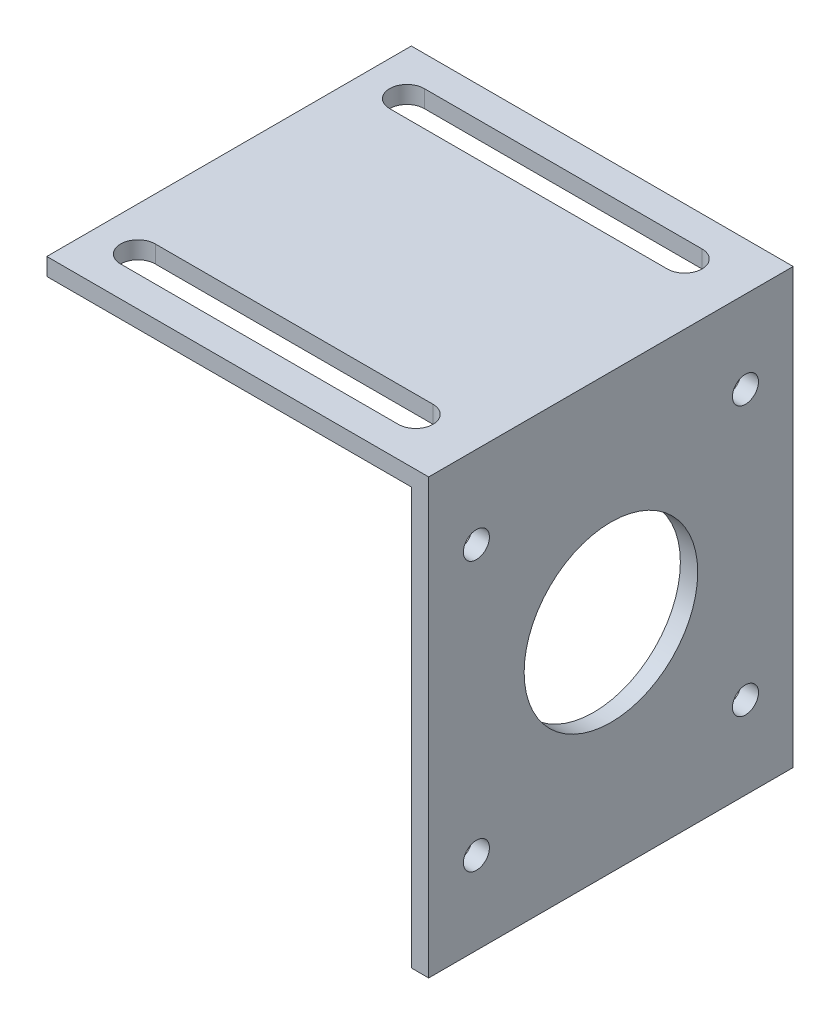
ISO-10303-21;
HEADER;
FILE_DESCRIPTION(('STEP AP214'),'2;1');
FILE_NAME('part.step','',(''),(''),'','','');
FILE_SCHEMA(('AUTOMOTIVE_DESIGN { 1 0 10303 214 1 1 1 1 }'));
ENDSEC;
DATA;
#1=APPLICATION_CONTEXT('core data for automotive mechanical design processes');
#2=APPLICATION_PROTOCOL_DEFINITION('international standard','automotive_design',2000,#1);
#3=PRODUCT_CONTEXT('',#1,'mechanical');
#4=PRODUCT('Part','Part','',(#3));
#5=PRODUCT_RELATED_PRODUCT_CATEGORY('part','',(#4));
#6=PRODUCT_DEFINITION_FORMATION('','',#4);
#7=PRODUCT_DEFINITION_CONTEXT('part definition',#1,'design');
#8=PRODUCT_DEFINITION('design','',#6,#7);
#9=PRODUCT_DEFINITION_SHAPE('','',#8);
#10=(LENGTH_UNIT() NAMED_UNIT(*) SI_UNIT(.MILLI.,.METRE.));
#11=(NAMED_UNIT(*) PLANE_ANGLE_UNIT() SI_UNIT($,.RADIAN.));
#12=(NAMED_UNIT(*) SI_UNIT($,.STERADIAN.) SOLID_ANGLE_UNIT());
#13=UNCERTAINTY_MEASURE_WITH_UNIT(LENGTH_MEASURE(1.E-05),#10,'distance_accuracy_value','');
#14=(GEOMETRIC_REPRESENTATION_CONTEXT(3) GLOBAL_UNCERTAINTY_ASSIGNED_CONTEXT((#13)) GLOBAL_UNIT_ASSIGNED_CONTEXT((#10,
#11,#12)) REPRESENTATION_CONTEXT('',''));
#15=CARTESIAN_POINT('',(0.,0.,0.));
#16=DIRECTION('',(0.,0.,1.));
#17=DIRECTION('',(1.,0.,0.));
#18=AXIS2_PLACEMENT_3D('',#15,#16,#17);
#19=CARTESIAN_POINT('',(2.,-25.,-21.));
#20=DIRECTION('',(0.,0.,1.));
#21=DIRECTION('',(1.,0.,0.));
#22=AXIS2_PLACEMENT_3D('',#19,#20,#21);
#23=PLANE('',#22);
#24=DIRECTION('',(-1.,0.,0.));
#25=VECTOR('',#24,1.);
#26=CARTESIAN_POINT('',(-42.,23.,-21.));
#27=LINE('',#26,#25);
#28=CARTESIAN_POINT('',(0.,23.,-21.));
#29=VERTEX_POINT('',#28);
#30=CARTESIAN_POINT('',(-42.,23.,-21.));
#31=VERTEX_POINT('',#30);
#32=EDGE_CURVE('E301',#29,#31,#27,.T.);
#33=ORIENTED_EDGE('',*,*,#32,.T.);
#34=DIRECTION('',(0.,-1.,0.));
#35=VECTOR('',#34,1.);
#36=CARTESIAN_POINT('',(-42.,25.,-21.));
#37=LINE('',#36,#35);
#38=CARTESIAN_POINT('',(-42.,25.,-21.));
#39=VERTEX_POINT('',#38);
#40=EDGE_CURVE('E205',#39,#31,#37,.T.);
#41=ORIENTED_EDGE('',*,*,#40,.F.);
#42=DIRECTION('',(-1.,0.,0.));
#43=VECTOR('',#42,1.);
#44=CARTESIAN_POINT('',(2.,25.,-21.));
#45=LINE('',#44,#43);
#46=CARTESIAN_POINT('',(2.,25.,-21.));
#47=VERTEX_POINT('',#46);
#48=EDGE_CURVE('E11',#47,#39,#45,.T.);
#49=ORIENTED_EDGE('',*,*,#48,.F.);
#50=DIRECTION('',(0.,1.,0.));
#51=VECTOR('',#50,1.);
#52=CARTESIAN_POINT('',(2.,-25.,-21.));
#53=LINE('',#52,#51);
#54=CARTESIAN_POINT('',(2.,-25.,-21.));
#55=VERTEX_POINT('',#54);
#56=EDGE_CURVE('E251',#55,#47,#53,.T.);
#57=ORIENTED_EDGE('',*,*,#56,.F.);
#58=DIRECTION('',(-1.,0.,0.));
#59=VECTOR('',#58,1.);
#60=CARTESIAN_POINT('',(2.,-25.,-21.));
#61=LINE('',#60,#59);
#62=CARTESIAN_POINT('',(0.,-25.,-21.));
#63=VERTEX_POINT('',#62);
#64=EDGE_CURVE('E265',#55,#63,#61,.T.);
#65=ORIENTED_EDGE('',*,*,#64,.T.);
#66=DIRECTION('',(0.,1.,0.));
#67=VECTOR('',#66,1.);
#68=CARTESIAN_POINT('',(0.,-25.,-21.));
#69=LINE('',#68,#67);
#70=EDGE_CURVE('E247',#63,#29,#69,.T.);
#71=ORIENTED_EDGE('',*,*,#70,.T.);
#72=EDGE_LOOP('',(#33,#41,#49,#57,#65,#71));
#73=FACE_BOUND('',#72,.T.);
#74=ADVANCED_FACE('F39',(#73),#23,.F.);
#75=CARTESIAN_POINT('',(2.,-25.,21.));
#76=DIRECTION('',(0.,0.,-1.));
#77=DIRECTION('',(-1.,0.,0.));
#78=AXIS2_PLACEMENT_3D('',#75,#76,#77);
#79=PLANE('',#78);
#80=DIRECTION('',(1.,0.,0.));
#81=VECTOR('',#80,1.);
#82=CARTESIAN_POINT('',(-42.,23.,21.));
#83=LINE('',#82,#81);
#84=CARTESIAN_POINT('',(-42.,23.,21.));
#85=VERTEX_POINT('',#84);
#86=CARTESIAN_POINT('',(0.,23.,21.));
#87=VERTEX_POINT('',#86);
#88=EDGE_CURVE('E227',#85,#87,#83,.T.);
#89=ORIENTED_EDGE('',*,*,#88,.T.);
#90=DIRECTION('',(0.,-1.,0.));
#91=VECTOR('',#90,1.);
#92=CARTESIAN_POINT('',(0.,-25.,21.));
#93=LINE('',#92,#91);
#94=CARTESIAN_POINT('',(0.,-25.,21.));
#95=VERTEX_POINT('',#94);
#96=EDGE_CURVE('E268',#87,#95,#93,.T.);
#97=ORIENTED_EDGE('',*,*,#96,.T.);
#98=DIRECTION('',(-1.,0.,0.));
#99=VECTOR('',#98,1.);
#100=CARTESIAN_POINT('',(2.,-25.,21.));
#101=LINE('',#100,#99);
#102=CARTESIAN_POINT('',(2.,-25.,21.));
#103=VERTEX_POINT('',#102);
#104=EDGE_CURVE('E276',#103,#95,#101,.T.);
#105=ORIENTED_EDGE('',*,*,#104,.F.);
#106=DIRECTION('',(0.,-1.,0.));
#107=VECTOR('',#106,1.);
#108=CARTESIAN_POINT('',(2.,-25.,21.));
#109=LINE('',#108,#107);
#110=CARTESIAN_POINT('',(2.,25.,21.));
#111=VERTEX_POINT('',#110);
#112=EDGE_CURVE('E259',#111,#103,#109,.T.);
#113=ORIENTED_EDGE('',*,*,#112,.F.);
#114=DIRECTION('',(-1.,0.,0.));
#115=VECTOR('',#114,1.);
#116=CARTESIAN_POINT('',(2.,25.,21.));
#117=LINE('',#116,#115);
#118=CARTESIAN_POINT('',(-42.,25.,21.));
#119=VERTEX_POINT('',#118);
#120=EDGE_CURVE('E47',#111,#119,#117,.T.);
#121=ORIENTED_EDGE('',*,*,#120,.T.);
#122=DIRECTION('',(0.,-1.,0.));
#123=VECTOR('',#122,1.);
#124=CARTESIAN_POINT('',(-42.,25.,21.));
#125=LINE('',#124,#123);
#126=EDGE_CURVE('E201',#119,#85,#125,.T.);
#127=ORIENTED_EDGE('',*,*,#126,.T.);
#128=EDGE_LOOP('',(#89,#97,#105,#113,#121,#127));
#129=FACE_BOUND('',#128,.T.);
#130=ADVANCED_FACE('F284',(#129),#79,.F.);
#131=CARTESIAN_POINT('',(-37.,25.,13.5));
#132=DIRECTION('',(0.,0.,1.));
#133=DIRECTION('',(1.,0.,0.));
#134=AXIS2_PLACEMENT_3D('',#131,#132,#133);
#135=PLANE('',#134);
#136=DIRECTION('',(0.,-1.,0.));
#137=VECTOR('',#136,1.);
#138=CARTESIAN_POINT('',(-37.,25.,13.5));
#139=LINE('',#138,#137);
#140=CARTESIAN_POINT('',(-37.,25.,13.5));
#141=VERTEX_POINT('',#140);
#142=CARTESIAN_POINT('',(-37.,23.,13.5));
#143=VERTEX_POINT('',#142);
#144=EDGE_CURVE('E322',#141,#143,#139,.T.);
#145=ORIENTED_EDGE('',*,*,#144,.T.);
#146=DIRECTION('',(-1.,0.,0.));
#147=VECTOR('',#146,1.);
#148=CARTESIAN_POINT('',(-37.,23.,13.5));
#149=LINE('',#148,#147);
#150=CARTESIAN_POINT('',(-5.,23.,13.5));
#151=VERTEX_POINT('',#150);
#152=EDGE_CURVE('E54',#151,#143,#149,.T.);
#153=ORIENTED_EDGE('',*,*,#152,.F.);
#154=DIRECTION('',(0.,-1.,0.));
#155=VECTOR('',#154,1.);
#156=CARTESIAN_POINT('',(-5.,25.,13.5));
#157=LINE('',#156,#155);
#158=CARTESIAN_POINT('',(-5.,25.,13.5));
#159=VERTEX_POINT('',#158);
#160=EDGE_CURVE('E168',#159,#151,#157,.T.);
#161=ORIENTED_EDGE('',*,*,#160,.F.);
#162=DIRECTION('',(-1.,0.,0.));
#163=VECTOR('',#162,1.);
#164=CARTESIAN_POINT('',(-37.,25.,13.5));
#165=LINE('',#164,#163);
#166=EDGE_CURVE('E319',#159,#141,#165,.T.);
#167=ORIENTED_EDGE('',*,*,#166,.T.);
#168=EDGE_LOOP('',(#145,#153,#161,#167));
#169=FACE_BOUND('',#168,.T.);
#170=ADVANCED_FACE('F331',(#169),#135,.T.);
#171=CARTESIAN_POINT('',(-5.00000000000001,25.,15.5));
#172=DIRECTION('',(0.,-1.,0.));
#173=DIRECTION('',(0.,0.,-1.));
#174=AXIS2_PLACEMENT_3D('',#171,#172,#173);
#175=CYLINDRICAL_SURFACE('',#174,2.00000000000001);
#176=ORIENTED_EDGE('',*,*,#160,.T.);
#177=CARTESIAN_POINT('',(-5.00000000000001,23.,15.5));
#178=DIRECTION('',(0.,1.,0.));
#179=DIRECTION('',(0.,0.,-1.));
#180=AXIS2_PLACEMENT_3D('',#177,#178,#179);
#181=CIRCLE('',#180,2.00000000000001);
#182=CARTESIAN_POINT('',(-5.00000000000001,23.,17.5));
#183=VERTEX_POINT('',#182);
#184=EDGE_CURVE('E156',#183,#151,#181,.T.);
#185=ORIENTED_EDGE('',*,*,#184,.F.);
#186=DIRECTION('',(0.,-1.,0.));
#187=VECTOR('',#186,1.);
#188=CARTESIAN_POINT('',(-5.00000000000001,25.,17.5));
#189=LINE('',#188,#187);
#190=CARTESIAN_POINT('',(-5.00000000000001,25.,17.5));
#191=VERTEX_POINT('',#190);
#192=EDGE_CURVE('E154',#191,#183,#189,.T.);
#193=ORIENTED_EDGE('',*,*,#192,.F.);
#194=CARTESIAN_POINT('',(-5.00000000000001,25.,15.5));
#195=DIRECTION('',(0.,1.,0.));
#196=DIRECTION('',(0.,0.,-1.));
#197=AXIS2_PLACEMENT_3D('',#194,#195,#196);
#198=CIRCLE('',#197,2.00000000000001);
#199=EDGE_CURVE('E315',#191,#159,#198,.T.);
#200=ORIENTED_EDGE('',*,*,#199,.T.);
#201=EDGE_LOOP('',(#176,#185,#193,#200));
#202=FACE_BOUND('',#201,.T.);
#203=ADVANCED_FACE('F327',(#202),#175,.F.);
#204=CARTESIAN_POINT('',(-37.,25.,17.5));
#205=DIRECTION('',(0.,0.,-1.));
#206=DIRECTION('',(-1.,0.,0.));
#207=AXIS2_PLACEMENT_3D('',#204,#205,#206);
#208=PLANE('',#207);
#209=ORIENTED_EDGE('',*,*,#192,.T.);
#210=DIRECTION('',(1.,0.,0.));
#211=VECTOR('',#210,1.);
#212=CARTESIAN_POINT('',(-37.,23.,17.5));
#213=LINE('',#212,#211);
#214=CARTESIAN_POINT('',(-37.,23.,17.5));
#215=VERTEX_POINT('',#214);
#216=EDGE_CURVE('E139',#215,#183,#213,.T.);
#217=ORIENTED_EDGE('',*,*,#216,.F.);
#218=DIRECTION('',(0.,-1.,0.));
#219=VECTOR('',#218,1.);
#220=CARTESIAN_POINT('',(-37.,25.,17.5));
#221=LINE('',#220,#219);
#222=CARTESIAN_POINT('',(-37.,25.,17.5));
#223=VERTEX_POINT('',#222);
#224=EDGE_CURVE('E151',#223,#215,#221,.T.);
#225=ORIENTED_EDGE('',*,*,#224,.F.);
#226=DIRECTION('',(1.,0.,0.));
#227=VECTOR('',#226,1.);
#228=CARTESIAN_POINT('',(-37.,25.,17.5));
#229=LINE('',#228,#227);
#230=EDGE_CURVE('E312',#223,#191,#229,.T.);
#231=ORIENTED_EDGE('',*,*,#230,.T.);
#232=EDGE_LOOP('',(#209,#217,#225,#231));
#233=FACE_BOUND('',#232,.T.);
#234=ADVANCED_FACE('F150',(#233),#208,.T.);
#235=CARTESIAN_POINT('',(-37.,25.,15.5));
#236=DIRECTION('',(0.,-1.,0.));
#237=DIRECTION('',(0.,0.,-1.));
#238=AXIS2_PLACEMENT_3D('',#235,#236,#237);
#239=CYLINDRICAL_SURFACE('',#238,2.);
#240=ORIENTED_EDGE('',*,*,#224,.T.);
#241=CARTESIAN_POINT('',(-37.,23.,15.5));
#242=DIRECTION('',(0.,1.,0.));
#243=DIRECTION('',(0.,0.,-1.));
#244=AXIS2_PLACEMENT_3D('',#241,#242,#243);
#245=CIRCLE('',#244,2.);
#246=EDGE_CURVE('E136',#143,#215,#245,.T.);
#247=ORIENTED_EDGE('',*,*,#246,.F.);
#248=ORIENTED_EDGE('',*,*,#144,.F.);
#249=CARTESIAN_POINT('',(-37.,25.,15.5));
#250=DIRECTION('',(0.,1.,0.));
#251=DIRECTION('',(0.,0.,-1.));
#252=AXIS2_PLACEMENT_3D('',#249,#250,#251);
#253=CIRCLE('',#252,2.);
#254=EDGE_CURVE('E160',#141,#223,#253,.T.);
#255=ORIENTED_EDGE('',*,*,#254,.T.);
#256=EDGE_LOOP('',(#240,#247,#248,#255));
#257=FACE_BOUND('',#256,.T.);
#258=ADVANCED_FACE('F158',(#257),#239,.F.);
#259=CARTESIAN_POINT('',(-37.,25.,-17.5));
#260=DIRECTION('',(0.,0.,1.));
#261=DIRECTION('',(1.,0.,0.));
#262=AXIS2_PLACEMENT_3D('',#259,#260,#261);
#263=PLANE('',#262);
#264=DIRECTION('',(0.,-1.,0.));
#265=VECTOR('',#264,1.);
#266=CARTESIAN_POINT('',(-37.,25.,-17.5));
#267=LINE('',#266,#265);
#268=CARTESIAN_POINT('',(-37.,25.,-17.5));
#269=VERTEX_POINT('',#268);
#270=CARTESIAN_POINT('',(-37.,23.,-17.5));
#271=VERTEX_POINT('',#270);
#272=EDGE_CURVE('E181',#269,#271,#267,.T.);
#273=ORIENTED_EDGE('',*,*,#272,.T.);
#274=DIRECTION('',(-1.,0.,0.));
#275=VECTOR('',#274,1.);
#276=CARTESIAN_POINT('',(-37.,23.,-17.5));
#277=LINE('',#276,#275);
#278=CARTESIAN_POINT('',(-5.00000000000001,23.,-17.5));
#279=VERTEX_POINT('',#278);
#280=EDGE_CURVE('E62',#279,#271,#277,.T.);
#281=ORIENTED_EDGE('',*,*,#280,.F.);
#282=DIRECTION('',(0.,-1.,0.));
#283=VECTOR('',#282,1.);
#284=CARTESIAN_POINT('',(-5.00000000000001,25.,-17.5));
#285=LINE('',#284,#283);
#286=CARTESIAN_POINT('',(-5.00000000000001,25.,-17.5));
#287=VERTEX_POINT('',#286);
#288=EDGE_CURVE('E185',#287,#279,#285,.T.);
#289=ORIENTED_EDGE('',*,*,#288,.F.);
#290=DIRECTION('',(-1.,0.,0.));
#291=VECTOR('',#290,1.);
#292=CARTESIAN_POINT('',(-37.,25.,-17.5));
#293=LINE('',#292,#291);
#294=EDGE_CURVE('E178',#287,#269,#293,.T.);
#295=ORIENTED_EDGE('',*,*,#294,.T.);
#296=EDGE_LOOP('',(#273,#281,#289,#295));
#297=FACE_BOUND('',#296,.T.);
#298=ADVANCED_FACE('F419',(#297),#263,.T.);
#299=CARTESIAN_POINT('',(-5.00000000000001,25.,-15.5));
#300=DIRECTION('',(0.,-1.,0.));
#301=DIRECTION('',(0.,0.,-1.));
#302=AXIS2_PLACEMENT_3D('',#299,#300,#301);
#303=CYLINDRICAL_SURFACE('',#302,2.00000000000001);
#304=ORIENTED_EDGE('',*,*,#288,.T.);
#305=CARTESIAN_POINT('',(-5.00000000000001,23.,-15.5));
#306=DIRECTION('',(0.,1.,0.));
#307=DIRECTION('',(0.,0.,1.));
#308=AXIS2_PLACEMENT_3D('',#305,#306,#307);
#309=CIRCLE('',#308,2.00000000000001);
#310=CARTESIAN_POINT('',(-5.,23.,-13.5));
#311=VERTEX_POINT('',#310);
#312=EDGE_CURVE('E343',#311,#279,#309,.T.);
#313=ORIENTED_EDGE('',*,*,#312,.F.);
#314=DIRECTION('',(0.,-1.,0.));
#315=VECTOR('',#314,1.);
#316=CARTESIAN_POINT('',(-5.,25.,-13.5));
#317=LINE('',#316,#315);
#318=CARTESIAN_POINT('',(-5.,25.,-13.5));
#319=VERTEX_POINT('',#318);
#320=EDGE_CURVE('E189',#319,#311,#317,.T.);
#321=ORIENTED_EDGE('',*,*,#320,.F.);
#322=CARTESIAN_POINT('',(-5.00000000000001,25.,-15.5));
#323=DIRECTION('',(0.,1.,0.));
#324=DIRECTION('',(0.,0.,1.));
#325=AXIS2_PLACEMENT_3D('',#322,#323,#324);
#326=CIRCLE('',#325,2.00000000000001);
#327=EDGE_CURVE('E174',#319,#287,#326,.T.);
#328=ORIENTED_EDGE('',*,*,#327,.T.);
#329=EDGE_LOOP('',(#304,#313,#321,#328));
#330=FACE_BOUND('',#329,.T.);
#331=ADVANCED_FACE('F415',(#330),#303,.F.);
#332=CARTESIAN_POINT('',(-37.,25.,-13.5));
#333=DIRECTION('',(0.,0.,-1.));
#334=DIRECTION('',(-1.,0.,0.));
#335=AXIS2_PLACEMENT_3D('',#332,#333,#334);
#336=PLANE('',#335);
#337=ORIENTED_EDGE('',*,*,#320,.T.);
#338=DIRECTION('',(1.,0.,0.));
#339=VECTOR('',#338,1.);
#340=CARTESIAN_POINT('',(-37.,23.,-13.5));
#341=LINE('',#340,#339);
#342=CARTESIAN_POINT('',(-37.,23.,-13.5));
#343=VERTEX_POINT('',#342);
#344=EDGE_CURVE('E337',#343,#311,#341,.T.);
#345=ORIENTED_EDGE('',*,*,#344,.F.);
#346=DIRECTION('',(0.,-1.,0.));
#347=VECTOR('',#346,1.);
#348=CARTESIAN_POINT('',(-37.,25.,-13.5));
#349=LINE('',#348,#347);
#350=CARTESIAN_POINT('',(-37.,25.,-13.5));
#351=VERTEX_POINT('',#350);
#352=EDGE_CURVE('E193',#351,#343,#349,.T.);
#353=ORIENTED_EDGE('',*,*,#352,.F.);
#354=DIRECTION('',(1.,0.,0.));
#355=VECTOR('',#354,1.);
#356=CARTESIAN_POINT('',(-37.,25.,-13.5));
#357=LINE('',#356,#355);
#358=EDGE_CURVE('E166',#351,#319,#357,.T.);
#359=ORIENTED_EDGE('',*,*,#358,.T.);
#360=EDGE_LOOP('',(#337,#345,#353,#359));
#361=FACE_BOUND('',#360,.T.);
#362=ADVANCED_FACE('F411',(#361),#336,.T.);
#363=CARTESIAN_POINT('',(-37.,25.,-15.5));
#364=DIRECTION('',(0.,-1.,0.));
#365=DIRECTION('',(0.,0.,-1.));
#366=AXIS2_PLACEMENT_3D('',#363,#364,#365);
#367=CYLINDRICAL_SURFACE('',#366,2.);
#368=ORIENTED_EDGE('',*,*,#352,.T.);
#369=CARTESIAN_POINT('',(-37.,23.,-15.5));
#370=DIRECTION('',(0.,1.,0.));
#371=DIRECTION('',(0.,0.,1.));
#372=AXIS2_PLACEMENT_3D('',#369,#370,#371);
#373=CIRCLE('',#372,2.);
#374=EDGE_CURVE('E333',#271,#343,#373,.T.);
#375=ORIENTED_EDGE('',*,*,#374,.F.);
#376=ORIENTED_EDGE('',*,*,#272,.F.);
#377=CARTESIAN_POINT('',(-37.,25.,-15.5));
#378=DIRECTION('',(0.,1.,0.));
#379=DIRECTION('',(0.,0.,1.));
#380=AXIS2_PLACEMENT_3D('',#377,#378,#379);
#381=CIRCLE('',#380,2.);
#382=EDGE_CURVE('E162',#269,#351,#381,.T.);
#383=ORIENTED_EDGE('',*,*,#382,.T.);
#384=EDGE_LOOP('',(#368,#375,#376,#383));
#385=FACE_BOUND('',#384,.T.);
#386=ADVANCED_FACE('F408',(#385),#367,.F.);
#387=CARTESIAN_POINT('',(-42.,25.,21.));
#388=DIRECTION('',(1.,0.,0.));
#389=DIRECTION('',(0.,0.,-1.));
#390=AXIS2_PLACEMENT_3D('',#387,#388,#389);
#391=PLANE('',#390);
#392=DIRECTION('',(0.,0.,1.));
#393=VECTOR('',#392,1.);
#394=CARTESIAN_POINT('',(-42.,23.,21.));
#395=LINE('',#394,#393);
#396=EDGE_CURVE('E296',#31,#85,#395,.T.);
#397=ORIENTED_EDGE('',*,*,#396,.T.);
#398=ORIENTED_EDGE('',*,*,#126,.F.);
#399=DIRECTION('',(0.,0.,1.));
#400=VECTOR('',#399,1.);
#401=CARTESIAN_POINT('',(-42.,25.,21.));
#402=LINE('',#401,#400);
#403=EDGE_CURVE('E197',#39,#119,#402,.T.);
#404=ORIENTED_EDGE('',*,*,#403,.F.);
#405=ORIENTED_EDGE('',*,*,#40,.T.);
#406=EDGE_LOOP('',(#397,#398,#404,#405));
#407=FACE_BOUND('',#406,.T.);
#408=ADVANCED_FACE('F295',(#407),#391,.F.);
#409=CARTESIAN_POINT('',(0.,0.,0.));
#410=DIRECTION('',(-1.,0.,0.));
#411=DIRECTION('',(0.,0.,1.));
#412=AXIS2_PLACEMENT_3D('',#409,#410,#411);
#413=PLANE('',#412);
#414=CARTESIAN_POINT('',(0.,0.,0.));
#415=DIRECTION('',(1.,0.,0.));
#416=DIRECTION('',(0.,0.,-1.));
#417=AXIS2_PLACEMENT_3D('',#414,#415,#416);
#418=CIRCLE('',#417,10.);
#419=CARTESIAN_POINT('',(0.,0.,-10.));
#420=VERTEX_POINT('',#419);
#421=EDGE_CURVE('E209',#420,#420,#418,.T.);
#422=ORIENTED_EDGE('',*,*,#421,.T.);
#423=EDGE_LOOP('',(#422));
#424=FACE_BOUND('',#423,.T.);
#425=CARTESIAN_POINT('',(0.,-15.5,15.5));
#426=DIRECTION('',(1.,0.,0.));
#427=DIRECTION('',(0.,0.,-1.));
#428=AXIS2_PLACEMENT_3D('',#425,#426,#427);
#429=CIRCLE('',#428,1.5);
#430=CARTESIAN_POINT('',(0.,-15.5,14.));
#431=VERTEX_POINT('',#430);
#432=EDGE_CURVE('E221',#431,#431,#429,.T.);
#433=ORIENTED_EDGE('',*,*,#432,.T.);
#434=EDGE_LOOP('',(#433));
#435=FACE_BOUND('',#434,.T.);
#436=CARTESIAN_POINT('',(0.,-15.5,-15.5));
#437=DIRECTION('',(1.,0.,0.));
#438=DIRECTION('',(0.,0.,1.));
#439=AXIS2_PLACEMENT_3D('',#436,#437,#438);
#440=CIRCLE('',#439,1.5);
#441=CARTESIAN_POINT('',(0.,-15.5,-14.));
#442=VERTEX_POINT('',#441);
#443=EDGE_CURVE('E232',#442,#442,#440,.T.);
#444=ORIENTED_EDGE('',*,*,#443,.T.);
#445=EDGE_LOOP('',(#444));
#446=FACE_BOUND('',#445,.T.);
#447=ORIENTED_EDGE('',*,*,#96,.F.);
#448=DIRECTION('',(0.,0.,-1.));
#449=VECTOR('',#448,1.);
#450=CARTESIAN_POINT('',(0.,23.,21.));
#451=LINE('',#450,#449);
#452=EDGE_CURVE('E306',#87,#29,#451,.T.);
#453=ORIENTED_EDGE('',*,*,#452,.T.);
#454=ORIENTED_EDGE('',*,*,#70,.F.);
#455=DIRECTION('',(0.,0.,-1.));
#456=VECTOR('',#455,1.);
#457=CARTESIAN_POINT('',(0.,-25.,21.));
#458=LINE('',#457,#456);
#459=EDGE_CURVE('E256',#95,#63,#458,.T.);
#460=ORIENTED_EDGE('',*,*,#459,.F.);
#461=EDGE_LOOP('',(#447,#453,#454,#460));
#462=FACE_BOUND('',#461,.T.);
#463=CARTESIAN_POINT('',(0.,15.5,15.5));
#464=DIRECTION('',(1.,0.,0.));
#465=DIRECTION('',(0.,0.,1.));
#466=AXIS2_PLACEMENT_3D('',#463,#464,#465);
#467=CIRCLE('',#466,1.50000000000002);
#468=CARTESIAN_POINT('',(0.,15.5,17.));
#469=VERTEX_POINT('',#468);
#470=EDGE_CURVE('E222',#469,#469,#467,.T.);
#471=ORIENTED_EDGE('',*,*,#470,.T.);
#472=EDGE_LOOP('',(#471));
#473=FACE_BOUND('',#472,.T.);
#474=CARTESIAN_POINT('',(0.,15.5,-15.5));
#475=DIRECTION('',(1.,0.,0.));
#476=DIRECTION('',(0.,0.,-1.));
#477=AXIS2_PLACEMENT_3D('',#474,#475,#476);
#478=CIRCLE('',#477,1.5);
#479=CARTESIAN_POINT('',(0.,15.5,-17.));
#480=VERTEX_POINT('',#479);
#481=EDGE_CURVE('E226',#480,#480,#478,.T.);
#482=ORIENTED_EDGE('',*,*,#481,.T.);
#483=EDGE_LOOP('',(#482));
#484=FACE_BOUND('',#483,.T.);
#485=ADVANCED_FACE('F352',(#424,#435,#446,#462,#473,#484),#413,.T.);
#486=CARTESIAN_POINT('',(2.,0.,0.));
#487=DIRECTION('',(-1.,0.,0.));
#488=DIRECTION('',(0.,0.,1.));
#489=AXIS2_PLACEMENT_3D('',#486,#487,#488);
#490=PLANE('',#489);
#491=ORIENTED_EDGE('',*,*,#56,.T.);
#492=DIRECTION('',(0.,0.,1.));
#493=VECTOR('',#492,1.);
#494=CARTESIAN_POINT('',(2.,25.,21.));
#495=LINE('',#494,#493);
#496=EDGE_CURVE('E255',#47,#111,#495,.T.);
#497=ORIENTED_EDGE('',*,*,#496,.T.);
#498=ORIENTED_EDGE('',*,*,#112,.T.);
#499=DIRECTION('',(0.,0.,-1.));
#500=VECTOR('',#499,1.);
#501=CARTESIAN_POINT('',(2.,-25.,21.));
#502=LINE('',#501,#500);
#503=EDGE_CURVE('E262',#103,#55,#502,.T.);
#504=ORIENTED_EDGE('',*,*,#503,.T.);
#505=EDGE_LOOP('',(#491,#497,#498,#504));
#506=FACE_BOUND('',#505,.T.);
#507=CARTESIAN_POINT('',(2.,15.5,-15.5));
#508=DIRECTION('',(1.,0.,0.));
#509=DIRECTION('',(0.,0.,-1.));
#510=AXIS2_PLACEMENT_3D('',#507,#508,#509);
#511=CIRCLE('',#510,1.5);
#512=CARTESIAN_POINT('',(2.,15.5,-17.));
#513=VERTEX_POINT('',#512);
#514=EDGE_CURVE('E240',#513,#513,#511,.T.);
#515=ORIENTED_EDGE('',*,*,#514,.F.);
#516=EDGE_LOOP('',(#515));
#517=FACE_BOUND('',#516,.T.);
#518=CARTESIAN_POINT('',(2.,-15.5,-15.5));
#519=DIRECTION('',(1.,0.,0.));
#520=DIRECTION('',(0.,0.,1.));
#521=AXIS2_PLACEMENT_3D('',#518,#519,#520);
#522=CIRCLE('',#521,1.5);
#523=CARTESIAN_POINT('',(2.,-15.5,-14.));
#524=VERTEX_POINT('',#523);
#525=EDGE_CURVE('E236',#524,#524,#522,.T.);
#526=ORIENTED_EDGE('',*,*,#525,.F.);
#527=EDGE_LOOP('',(#526));
#528=FACE_BOUND('',#527,.T.);
#529=CARTESIAN_POINT('',(2.,-15.5,15.5));
#530=DIRECTION('',(1.,0.,0.));
#531=DIRECTION('',(0.,0.,-1.));
#532=AXIS2_PLACEMENT_3D('',#529,#530,#531);
#533=CIRCLE('',#532,1.5);
#534=CARTESIAN_POINT('',(2.,-15.5,14.));
#535=VERTEX_POINT('',#534);
#536=EDGE_CURVE('E228',#535,#535,#533,.T.);
#537=ORIENTED_EDGE('',*,*,#536,.F.);
#538=EDGE_LOOP('',(#537));
#539=FACE_BOUND('',#538,.T.);
#540=CARTESIAN_POINT('',(2.,15.5,15.5));
#541=DIRECTION('',(1.,0.,0.));
#542=DIRECTION('',(0.,0.,1.));
#543=AXIS2_PLACEMENT_3D('',#540,#541,#542);
#544=CIRCLE('',#543,1.50000000000002);
#545=CARTESIAN_POINT('',(2.,15.5,17.));
#546=VERTEX_POINT('',#545);
#547=EDGE_CURVE('E214',#546,#546,#544,.T.);
#548=ORIENTED_EDGE('',*,*,#547,.F.);
#549=EDGE_LOOP('',(#548));
#550=FACE_BOUND('',#549,.T.);
#551=CARTESIAN_POINT('',(2.,0.,0.));
#552=DIRECTION('',(1.,0.,0.));
#553=DIRECTION('',(0.,0.,-1.));
#554=AXIS2_PLACEMENT_3D('',#551,#552,#553);
#555=CIRCLE('',#554,10.);
#556=CARTESIAN_POINT('',(2.,0.,-10.));
#557=VERTEX_POINT('',#556);
#558=EDGE_CURVE('E210',#557,#557,#555,.T.);
#559=ORIENTED_EDGE('',*,*,#558,.F.);
#560=EDGE_LOOP('',(#559));
#561=FACE_BOUND('',#560,.T.);
#562=ADVANCED_FACE('F361',(#506,#517,#528,#539,#550,#561),#490,.F.);
#563=CARTESIAN_POINT('',(2.,25.,21.));
#564=DIRECTION('',(0.,-1.,0.));
#565=DIRECTION('',(0.,0.,-1.));
#566=AXIS2_PLACEMENT_3D('',#563,#564,#565);
#567=PLANE('',#566);
#568=ORIENTED_EDGE('',*,*,#48,.T.);
#569=ORIENTED_EDGE('',*,*,#403,.T.);
#570=ORIENTED_EDGE('',*,*,#120,.F.);
#571=ORIENTED_EDGE('',*,*,#496,.F.);
#572=EDGE_LOOP('',(#568,#569,#570,#571));
#573=FACE_BOUND('',#572,.T.);
#574=ORIENTED_EDGE('',*,*,#382,.F.);
#575=ORIENTED_EDGE('',*,*,#294,.F.);
#576=ORIENTED_EDGE('',*,*,#327,.F.);
#577=ORIENTED_EDGE('',*,*,#358,.F.);
#578=EDGE_LOOP('',(#574,#575,#576,#577));
#579=FACE_BOUND('',#578,.T.);
#580=ORIENTED_EDGE('',*,*,#254,.F.);
#581=ORIENTED_EDGE('',*,*,#166,.F.);
#582=ORIENTED_EDGE('',*,*,#199,.F.);
#583=ORIENTED_EDGE('',*,*,#230,.F.);
#584=EDGE_LOOP('',(#580,#581,#582,#583));
#585=FACE_BOUND('',#584,.T.);
#586=ADVANCED_FACE('F289',(#573,#579,#585),#567,.F.);
#587=CARTESIAN_POINT('',(2.,-25.,21.));
#588=DIRECTION('',(0.,1.,0.));
#589=DIRECTION('',(0.,0.,1.));
#590=AXIS2_PLACEMENT_3D('',#587,#588,#589);
#591=PLANE('',#590);
#592=ORIENTED_EDGE('',*,*,#459,.T.);
#593=ORIENTED_EDGE('',*,*,#64,.F.);
#594=ORIENTED_EDGE('',*,*,#503,.F.);
#595=ORIENTED_EDGE('',*,*,#104,.T.);
#596=EDGE_LOOP('',(#592,#593,#594,#595));
#597=FACE_BOUND('',#596,.T.);
#598=ADVANCED_FACE('F357',(#597),#591,.F.);
#599=CARTESIAN_POINT('',(2.,15.5,-15.5));
#600=DIRECTION('',(-1.,0.,0.));
#601=DIRECTION('',(0.,0.,1.));
#602=AXIS2_PLACEMENT_3D('',#599,#600,#601);
#603=CYLINDRICAL_SURFACE('',#602,1.5);
#604=ORIENTED_EDGE('',*,*,#514,.T.);
#605=EDGE_LOOP('',(#604));
#606=FACE_BOUND('',#605,.T.);
#607=ORIENTED_EDGE('',*,*,#481,.F.);
#608=EDGE_LOOP('',(#607));
#609=FACE_BOUND('',#608,.T.);
#610=ADVANCED_FACE('F380',(#606,#609),#603,.F.);
#611=CARTESIAN_POINT('',(2.,-15.5,-15.5));
#612=DIRECTION('',(-1.,0.,0.));
#613=DIRECTION('',(0.,0.,1.));
#614=AXIS2_PLACEMENT_3D('',#611,#612,#613);
#615=CYLINDRICAL_SURFACE('',#614,1.5);
#616=ORIENTED_EDGE('',*,*,#525,.T.);
#617=EDGE_LOOP('',(#616));
#618=FACE_BOUND('',#617,.T.);
#619=ORIENTED_EDGE('',*,*,#443,.F.);
#620=EDGE_LOOP('',(#619));
#621=FACE_BOUND('',#620,.T.);
#622=ADVANCED_FACE('F389',(#618,#621),#615,.F.);
#623=CARTESIAN_POINT('',(2.,-15.5,15.5));
#624=DIRECTION('',(-1.,0.,0.));
#625=DIRECTION('',(0.,0.,1.));
#626=AXIS2_PLACEMENT_3D('',#623,#624,#625);
#627=CYLINDRICAL_SURFACE('',#626,1.5);
#628=ORIENTED_EDGE('',*,*,#536,.T.);
#629=EDGE_LOOP('',(#628));
#630=FACE_BOUND('',#629,.T.);
#631=ORIENTED_EDGE('',*,*,#432,.F.);
#632=EDGE_LOOP('',(#631));
#633=FACE_BOUND('',#632,.T.);
#634=ADVANCED_FACE('F393',(#630,#633),#627,.F.);
#635=CARTESIAN_POINT('',(2.,15.5,15.5));
#636=DIRECTION('',(-1.,0.,0.));
#637=DIRECTION('',(0.,0.,1.));
#638=AXIS2_PLACEMENT_3D('',#635,#636,#637);
#639=CYLINDRICAL_SURFACE('',#638,1.50000000000002);
#640=ORIENTED_EDGE('',*,*,#547,.T.);
#641=EDGE_LOOP('',(#640));
#642=FACE_BOUND('',#641,.T.);
#643=ORIENTED_EDGE('',*,*,#470,.F.);
#644=EDGE_LOOP('',(#643));
#645=FACE_BOUND('',#644,.T.);
#646=ADVANCED_FACE('F397',(#642,#645),#639,.F.);
#647=CARTESIAN_POINT('',(2.,0.,0.));
#648=DIRECTION('',(-1.,0.,0.));
#649=DIRECTION('',(0.,0.,1.));
#650=AXIS2_PLACEMENT_3D('',#647,#648,#649);
#651=CYLINDRICAL_SURFACE('',#650,10.);
#652=ORIENTED_EDGE('',*,*,#558,.T.);
#653=EDGE_LOOP('',(#652));
#654=FACE_BOUND('',#653,.T.);
#655=ORIENTED_EDGE('',*,*,#421,.F.);
#656=EDGE_LOOP('',(#655));
#657=FACE_BOUND('',#656,.T.);
#658=ADVANCED_FACE('F401',(#654,#657),#651,.F.);
#659=CARTESIAN_POINT('',(0.,23.,0.));
#660=DIRECTION('',(0.,-1.,0.));
#661=DIRECTION('',(0.,0.,-1.));
#662=AXIS2_PLACEMENT_3D('',#659,#660,#661);
#663=PLANE('',#662);
#664=ORIENTED_EDGE('',*,*,#374,.T.);
#665=ORIENTED_EDGE('',*,*,#344,.T.);
#666=ORIENTED_EDGE('',*,*,#312,.T.);
#667=ORIENTED_EDGE('',*,*,#280,.T.);
#668=EDGE_LOOP('',(#664,#665,#666,#667));
#669=FACE_BOUND('',#668,.T.);
#670=ORIENTED_EDGE('',*,*,#452,.F.);
#671=ORIENTED_EDGE('',*,*,#88,.F.);
#672=ORIENTED_EDGE('',*,*,#396,.F.);
#673=ORIENTED_EDGE('',*,*,#32,.F.);
#674=EDGE_LOOP('',(#670,#671,#672,#673));
#675=FACE_BOUND('',#674,.T.);
#676=ORIENTED_EDGE('',*,*,#246,.T.);
#677=ORIENTED_EDGE('',*,*,#216,.T.);
#678=ORIENTED_EDGE('',*,*,#184,.T.);
#679=ORIENTED_EDGE('',*,*,#152,.T.);
#680=EDGE_LOOP('',(#676,#677,#678,#679));
#681=FACE_BOUND('',#680,.T.);
#682=ADVANCED_FACE('F138',(#669,#675,#681),#663,.T.);
#683=CLOSED_SHELL('',(#74,#130,#170,#203,#234,#258,#298,#331,#362,#386,#408,#485,#562,#586,#598,
#610,#622,#634,#646,#658,#682));
#684=MANIFOLD_SOLID_BREP('B2',#683);
#685=ADVANCED_BREP_SHAPE_REPRESENTATION('',(#18,#684),#14);
#686=SHAPE_DEFINITION_REPRESENTATION(#9,#685);
ENDSEC;
END-ISO-10303-21;
